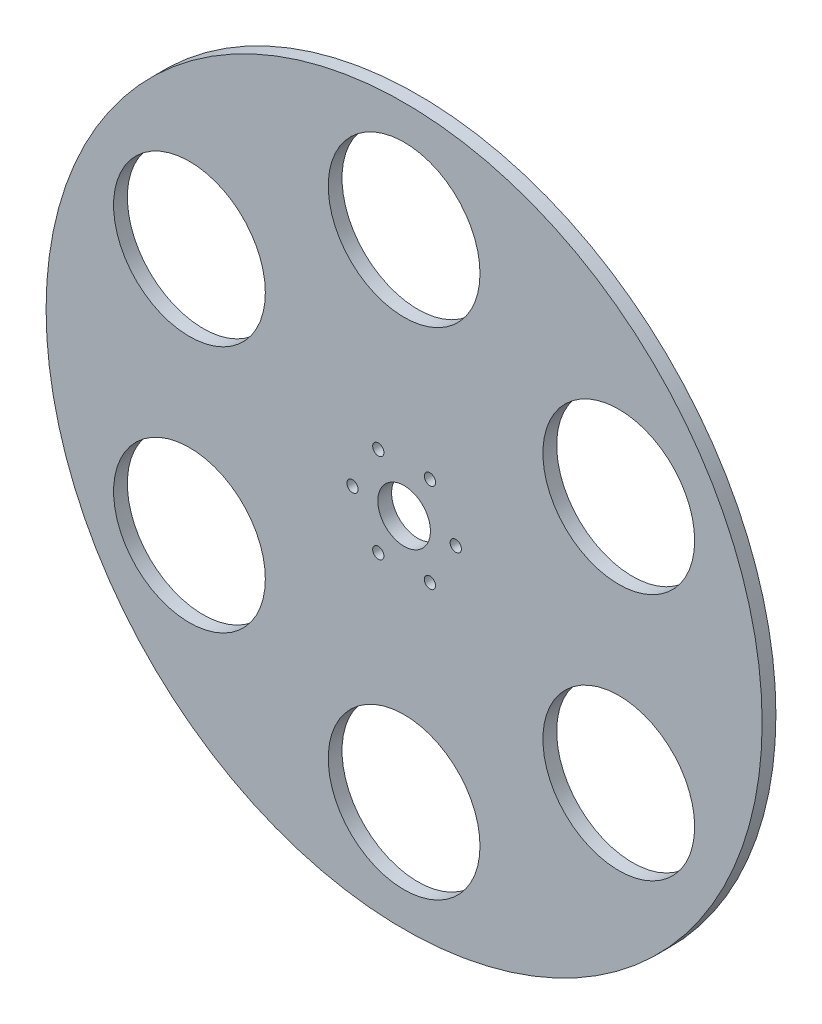
ISO-10303-21;
HEADER;
FILE_DESCRIPTION(('STEP AP214'),'2;1');
FILE_NAME('part.step','',(''),(''),'','','');
FILE_SCHEMA(('AUTOMOTIVE_DESIGN { 1 0 10303 214 1 1 1 1 }'));
ENDSEC;
DATA;
#1=APPLICATION_CONTEXT('core data for automotive mechanical design processes');
#2=APPLICATION_PROTOCOL_DEFINITION('international standard','automotive_design',2000,#1);
#3=PRODUCT_CONTEXT('',#1,'mechanical');
#4=PRODUCT('Part','Part','',(#3));
#5=PRODUCT_RELATED_PRODUCT_CATEGORY('part','',(#4));
#6=PRODUCT_DEFINITION_FORMATION('','',#4);
#7=PRODUCT_DEFINITION_CONTEXT('part definition',#1,'design');
#8=PRODUCT_DEFINITION('design','',#6,#7);
#9=PRODUCT_DEFINITION_SHAPE('','',#8);
#10=(LENGTH_UNIT() NAMED_UNIT(*) SI_UNIT(.MILLI.,.METRE.));
#11=(NAMED_UNIT(*) PLANE_ANGLE_UNIT() SI_UNIT($,.RADIAN.));
#12=(NAMED_UNIT(*) SI_UNIT($,.STERADIAN.) SOLID_ANGLE_UNIT());
#13=UNCERTAINTY_MEASURE_WITH_UNIT(LENGTH_MEASURE(1.E-05),#10,'distance_accuracy_value','');
#14=(GEOMETRIC_REPRESENTATION_CONTEXT(3) GLOBAL_UNCERTAINTY_ASSIGNED_CONTEXT((#13)) GLOBAL_UNIT_ASSIGNED_CONTEXT((#10,
#11,#12)) REPRESENTATION_CONTEXT('',''));
#15=CARTESIAN_POINT('',(0.,0.,0.));
#16=DIRECTION('',(0.,0.,1.));
#17=DIRECTION('',(1.,0.,0.));
#18=AXIS2_PLACEMENT_3D('',#15,#16,#17);
#19=CARTESIAN_POINT('',(0.,0.,3.175));
#20=DIRECTION('',(0.,0.,1.));
#21=DIRECTION('',(1.,0.,0.));
#22=AXIS2_PLACEMENT_3D('',#19,#20,#21);
#23=PLANE('',#22);
#24=CARTESIAN_POINT('',(11.9062500000002,-20.6222299276171,3.175));
#25=DIRECTION('',(0.,0.,1.));
#26=DIRECTION('',(1.,0.,0.));
#27=AXIS2_PLACEMENT_3D('',#24,#25,#26);
#28=CIRCLE('',#27,2.5908);
#29=CARTESIAN_POINT('',(14.4970500000002,-20.6222299276171,3.175));
#30=VERTEX_POINT('',#29);
#31=EDGE_CURVE('E130',#30,#30,#28,.F.);
#32=ORIENTED_EDGE('',*,*,#31,.T.);
#33=EDGE_LOOP('',(#32));
#34=FACE_BOUND('',#33,.T.);
#35=CARTESIAN_POINT('',(-11.9062499999998,-20.6222299276174,3.175));
#36=DIRECTION('',(0.,0.,1.));
#37=DIRECTION('',(1.,0.,0.));
#38=AXIS2_PLACEMENT_3D('',#35,#36,#37);
#39=CIRCLE('',#38,2.5908);
#40=CARTESIAN_POINT('',(-9.31544999999975,-20.6222299276174,3.175));
#41=VERTEX_POINT('',#40);
#42=EDGE_CURVE('E134',#41,#41,#39,.F.);
#43=ORIENTED_EDGE('',*,*,#42,.T.);
#44=EDGE_LOOP('',(#43));
#45=FACE_BOUND('',#44,.T.);
#46=CARTESIAN_POINT('',(-23.8125,-5.93829665384531E-13,3.175));
#47=DIRECTION('',(0.,0.,1.));
#48=DIRECTION('',(1.,0.,0.));
#49=AXIS2_PLACEMENT_3D('',#46,#47,#48);
#50=CIRCLE('',#49,2.59080000000001);
#51=CARTESIAN_POINT('',(-21.2217,-5.93829665384531E-13,3.175));
#52=VERTEX_POINT('',#51);
#53=EDGE_CURVE('E138',#52,#52,#50,.F.);
#54=ORIENTED_EDGE('',*,*,#53,.T.);
#55=EDGE_LOOP('',(#54));
#56=FACE_BOUND('',#55,.T.);
#57=CARTESIAN_POINT('',(-11.9062500000003,20.6222299276165,3.175));
#58=DIRECTION('',(0.,0.,1.));
#59=DIRECTION('',(1.,0.,0.));
#60=AXIS2_PLACEMENT_3D('',#57,#58,#59);
#61=CIRCLE('',#60,2.5908);
#62=CARTESIAN_POINT('',(-9.31545000000025,20.6222299276165,3.175));
#63=VERTEX_POINT('',#62);
#64=EDGE_CURVE('E142',#63,#63,#61,.F.);
#65=ORIENTED_EDGE('',*,*,#64,.T.);
#66=EDGE_LOOP('',(#65));
#67=FACE_BOUND('',#66,.T.);
#68=CARTESIAN_POINT('',(11.9062499999997,20.6222299276168,3.175));
#69=DIRECTION('',(0.,0.,1.));
#70=DIRECTION('',(1.,0.,0.));
#71=AXIS2_PLACEMENT_3D('',#68,#69,#70);
#72=CIRCLE('',#71,2.5908);
#73=CARTESIAN_POINT('',(14.4970499999998,20.6222299276168,3.175));
#74=VERTEX_POINT('',#73);
#75=EDGE_CURVE('E146',#74,#74,#72,.F.);
#76=ORIENTED_EDGE('',*,*,#75,.T.);
#77=EDGE_LOOP('',(#76));
#78=FACE_BOUND('',#77,.T.);
#79=CARTESIAN_POINT('',(23.8125,0.,3.175));
#80=DIRECTION('',(0.,0.,1.));
#81=DIRECTION('',(1.,0.,0.));
#82=AXIS2_PLACEMENT_3D('',#79,#80,#81);
#83=CIRCLE('',#82,2.5908);
#84=CARTESIAN_POINT('',(26.4033,0.,3.175));
#85=VERTEX_POINT('',#84);
#86=EDGE_CURVE('E67',#85,#85,#83,.F.);
#87=ORIENTED_EDGE('',*,*,#86,.T.);
#88=EDGE_LOOP('',(#87));
#89=FACE_BOUND('',#88,.T.);
#90=CARTESIAN_POINT('',(-98.9867036525522,-57.1500000000053,3.175));
#91=DIRECTION('',(0.,0.,1.));
#92=DIRECTION('',(1.,0.,0.));
#93=AXIS2_PLACEMENT_3D('',#90,#91,#92);
#94=CIRCLE('',#93,34.9885);
#95=CARTESIAN_POINT('',(-63.9982036525522,-57.1500000000053,3.175));
#96=VERTEX_POINT('',#95);
#97=EDGE_CURVE('E69',#96,#96,#94,.T.);
#98=ORIENTED_EDGE('',*,*,#97,.F.);
#99=EDGE_LOOP('',(#98));
#100=FACE_BOUND('',#99,.T.);
#101=CARTESIAN_POINT('',(98.9867036525704,-57.1499999999947,3.175));
#102=DIRECTION('',(0.,0.,1.));
#103=DIRECTION('',(1.,0.,0.));
#104=AXIS2_PLACEMENT_3D('',#101,#102,#103);
#105=CIRCLE('',#104,34.9885);
#106=CARTESIAN_POINT('',(133.97520365257,-57.1499999999947,3.175));
#107=VERTEX_POINT('',#106);
#108=EDGE_CURVE('E83',#107,#107,#105,.T.);
#109=ORIENTED_EDGE('',*,*,#108,.F.);
#110=EDGE_LOOP('',(#109));
#111=FACE_BOUND('',#110,.T.);
#112=CARTESIAN_POINT('',(0.,0.,3.175));
#113=DIRECTION('',(0.,0.,1.));
#114=DIRECTION('',(1.,0.,0.));
#115=AXIS2_PLACEMENT_3D('',#112,#113,#114);
#116=CIRCLE('',#115,12.1285);
#117=CARTESIAN_POINT('',(12.1285,0.,3.175));
#118=VERTEX_POINT('',#117);
#119=EDGE_CURVE('E52',#118,#118,#116,.T.);
#120=ORIENTED_EDGE('',*,*,#119,.F.);
#121=EDGE_LOOP('',(#120));
#122=FACE_BOUND('',#121,.T.);
#123=CARTESIAN_POINT('',(0.,0.,3.175));
#124=DIRECTION('',(0.,0.,1.));
#125=DIRECTION('',(1.,0.,0.));
#126=AXIS2_PLACEMENT_3D('',#123,#124,#125);
#127=CIRCLE('',#126,165.1);
#128=CARTESIAN_POINT('',(165.1,0.,3.175));
#129=VERTEX_POINT('',#128);
#130=EDGE_CURVE('E11',#129,#129,#127,.T.);
#131=ORIENTED_EDGE('',*,*,#130,.T.);
#132=EDGE_LOOP('',(#131));
#133=FACE_BOUND('',#132,.T.);
#134=CARTESIAN_POINT('',(0.,114.3,3.175));
#135=DIRECTION('',(0.,0.,1.));
#136=DIRECTION('',(1.,0.,0.));
#137=AXIS2_PLACEMENT_3D('',#134,#135,#136);
#138=CIRCLE('',#137,34.9885);
#139=CARTESIAN_POINT('',(34.9885,114.3,3.175));
#140=VERTEX_POINT('',#139);
#141=EDGE_CURVE('E46',#140,#140,#138,.T.);
#142=ORIENTED_EDGE('',*,*,#141,.F.);
#143=EDGE_LOOP('',(#142));
#144=FACE_BOUND('',#143,.T.);
#145=CARTESIAN_POINT('',(98.9867036525643,57.1500000000053,3.175));
#146=DIRECTION('',(0.,0.,1.));
#147=DIRECTION('',(1.,0.,0.));
#148=AXIS2_PLACEMENT_3D('',#145,#146,#147);
#149=CIRCLE('',#148,34.9885);
#150=CARTESIAN_POINT('',(133.975203652564,57.1500000000053,3.175));
#151=VERTEX_POINT('',#150);
#152=EDGE_CURVE('E90',#151,#151,#149,.T.);
#153=ORIENTED_EDGE('',*,*,#152,.F.);
#154=EDGE_LOOP('',(#153));
#155=FACE_BOUND('',#154,.T.);
#156=CARTESIAN_POINT('',(1.21510900920431E-11,-114.3,3.175));
#157=DIRECTION('',(0.,0.,1.));
#158=DIRECTION('',(1.,0.,0.));
#159=AXIS2_PLACEMENT_3D('',#156,#157,#158);
#160=CIRCLE('',#159,34.9885);
#161=CARTESIAN_POINT('',(34.9885000000122,-114.3,3.175));
#162=VERTEX_POINT('',#161);
#163=EDGE_CURVE('E76',#162,#162,#160,.T.);
#164=ORIENTED_EDGE('',*,*,#163,.F.);
#165=EDGE_LOOP('',(#164));
#166=FACE_BOUND('',#165,.T.);
#167=CARTESIAN_POINT('',(-98.9867036525583,57.1499999999947,3.175));
#168=DIRECTION('',(0.,0.,1.));
#169=DIRECTION('',(1.,0.,0.));
#170=AXIS2_PLACEMENT_3D('',#167,#168,#169);
#171=CIRCLE('',#170,34.9885);
#172=CARTESIAN_POINT('',(-63.9982036525583,57.1499999999947,3.175));
#173=VERTEX_POINT('',#172);
#174=EDGE_CURVE('E66',#173,#173,#171,.T.);
#175=ORIENTED_EDGE('',*,*,#174,.F.);
#176=EDGE_LOOP('',(#175));
#177=FACE_BOUND('',#176,.T.);
#178=ADVANCED_FACE('F34',(#34,#45,#56,#67,#78,#89,#100,#111,#122,#133,#144,#155,#166,#177),#23,.T.);
#179=CARTESIAN_POINT('',(0.,0.,-3.175));
#180=DIRECTION('',(0.,0.,1.));
#181=DIRECTION('',(1.,0.,0.));
#182=AXIS2_PLACEMENT_3D('',#179,#180,#181);
#183=PLANE('',#182);
#184=CARTESIAN_POINT('',(11.9062500000002,-20.6222299276171,-3.175));
#185=DIRECTION('',(0.,0.,-1.));
#186=DIRECTION('',(-1.,0.,0.));
#187=AXIS2_PLACEMENT_3D('',#184,#185,#186);
#188=CIRCLE('',#187,2.5908);
#189=CARTESIAN_POINT('',(9.31545000000024,-20.6222299276171,-3.175));
#190=VERTEX_POINT('',#189);
#191=EDGE_CURVE('E290',#190,#190,#188,.T.);
#192=ORIENTED_EDGE('',*,*,#191,.F.);
#193=EDGE_LOOP('',(#192));
#194=FACE_BOUND('',#193,.T.);
#195=CARTESIAN_POINT('',(-11.9062499999998,-20.6222299276174,-3.175));
#196=DIRECTION('',(0.,0.,-1.));
#197=DIRECTION('',(-1.,0.,0.));
#198=AXIS2_PLACEMENT_3D('',#195,#196,#197);
#199=CIRCLE('',#198,2.5908);
#200=CARTESIAN_POINT('',(-14.4970499999998,-20.6222299276174,-3.175));
#201=VERTEX_POINT('',#200);
#202=EDGE_CURVE('E291',#201,#201,#199,.T.);
#203=ORIENTED_EDGE('',*,*,#202,.F.);
#204=EDGE_LOOP('',(#203));
#205=FACE_BOUND('',#204,.T.);
#206=CARTESIAN_POINT('',(-23.8125,-5.93829665384531E-13,-3.175));
#207=DIRECTION('',(0.,0.,-1.));
#208=DIRECTION('',(-1.,0.,0.));
#209=AXIS2_PLACEMENT_3D('',#206,#207,#208);
#210=CIRCLE('',#209,2.59080000000001);
#211=CARTESIAN_POINT('',(-26.4033,-5.93829665384531E-13,-3.175));
#212=VERTEX_POINT('',#211);
#213=EDGE_CURVE('E298',#212,#212,#210,.T.);
#214=ORIENTED_EDGE('',*,*,#213,.F.);
#215=EDGE_LOOP('',(#214));
#216=FACE_BOUND('',#215,.T.);
#217=CARTESIAN_POINT('',(-11.9062500000003,20.6222299276165,-3.175));
#218=DIRECTION('',(0.,0.,-1.));
#219=DIRECTION('',(-1.,0.,0.));
#220=AXIS2_PLACEMENT_3D('',#217,#218,#219);
#221=CIRCLE('',#220,2.5908);
#222=CARTESIAN_POINT('',(-14.4970500000003,20.6222299276165,-3.175));
#223=VERTEX_POINT('',#222);
#224=EDGE_CURVE('E302',#223,#223,#221,.T.);
#225=ORIENTED_EDGE('',*,*,#224,.F.);
#226=EDGE_LOOP('',(#225));
#227=FACE_BOUND('',#226,.T.);
#228=CARTESIAN_POINT('',(11.9062499999997,20.6222299276168,-3.175));
#229=DIRECTION('',(0.,0.,-1.));
#230=DIRECTION('',(-1.,0.,0.));
#231=AXIS2_PLACEMENT_3D('',#228,#229,#230);
#232=CIRCLE('',#231,2.5908);
#233=CARTESIAN_POINT('',(9.31544999999975,20.6222299276168,-3.175));
#234=VERTEX_POINT('',#233);
#235=EDGE_CURVE('E306',#234,#234,#232,.T.);
#236=ORIENTED_EDGE('',*,*,#235,.F.);
#237=EDGE_LOOP('',(#236));
#238=FACE_BOUND('',#237,.T.);
#239=CARTESIAN_POINT('',(23.8125,0.,-3.175));
#240=DIRECTION('',(0.,0.,-1.));
#241=DIRECTION('',(-1.,0.,0.));
#242=AXIS2_PLACEMENT_3D('',#239,#240,#241);
#243=CIRCLE('',#242,2.5908);
#244=CARTESIAN_POINT('',(21.2217,0.,-3.175));
#245=VERTEX_POINT('',#244);
#246=EDGE_CURVE('E310',#245,#245,#243,.T.);
#247=ORIENTED_EDGE('',*,*,#246,.F.);
#248=EDGE_LOOP('',(#247));
#249=FACE_BOUND('',#248,.T.);
#250=CARTESIAN_POINT('',(0.,0.,-3.175));
#251=DIRECTION('',(0.,0.,1.));
#252=DIRECTION('',(1.,0.,0.));
#253=AXIS2_PLACEMENT_3D('',#250,#251,#252);
#254=CIRCLE('',#253,165.1);
#255=CARTESIAN_POINT('',(165.1,0.,-3.175));
#256=VERTEX_POINT('',#255);
#257=EDGE_CURVE('E38',#256,#256,#254,.T.);
#258=ORIENTED_EDGE('',*,*,#257,.F.);
#259=EDGE_LOOP('',(#258));
#260=FACE_BOUND('',#259,.T.);
#261=CARTESIAN_POINT('',(0.,114.3,-3.175));
#262=DIRECTION('',(0.,0.,1.));
#263=DIRECTION('',(1.,0.,0.));
#264=AXIS2_PLACEMENT_3D('',#261,#262,#263);
#265=CIRCLE('',#264,34.9885);
#266=CARTESIAN_POINT('',(34.9885,114.3,-3.175));
#267=VERTEX_POINT('',#266);
#268=EDGE_CURVE('E48',#267,#267,#265,.T.);
#269=ORIENTED_EDGE('',*,*,#268,.T.);
#270=EDGE_LOOP('',(#269));
#271=FACE_BOUND('',#270,.T.);
#272=CARTESIAN_POINT('',(0.,0.,-3.175));
#273=DIRECTION('',(0.,0.,1.));
#274=DIRECTION('',(1.,0.,0.));
#275=AXIS2_PLACEMENT_3D('',#272,#273,#274);
#276=CIRCLE('',#275,12.1285);
#277=CARTESIAN_POINT('',(12.1285,0.,-3.175));
#278=VERTEX_POINT('',#277);
#279=EDGE_CURVE('E92',#278,#278,#276,.T.);
#280=ORIENTED_EDGE('',*,*,#279,.T.);
#281=EDGE_LOOP('',(#280));
#282=FACE_BOUND('',#281,.T.);
#283=CARTESIAN_POINT('',(98.9867036525643,57.1500000000053,-3.175));
#284=DIRECTION('',(0.,0.,1.));
#285=DIRECTION('',(1.,0.,0.));
#286=AXIS2_PLACEMENT_3D('',#283,#284,#285);
#287=CIRCLE('',#286,34.9885);
#288=CARTESIAN_POINT('',(133.975203652564,57.1500000000053,-3.175));
#289=VERTEX_POINT('',#288);
#290=EDGE_CURVE('E93',#289,#289,#287,.T.);
#291=ORIENTED_EDGE('',*,*,#290,.T.);
#292=EDGE_LOOP('',(#291));
#293=FACE_BOUND('',#292,.T.);
#294=CARTESIAN_POINT('',(98.9867036525704,-57.1499999999947,-3.175));
#295=DIRECTION('',(0.,0.,1.));
#296=DIRECTION('',(1.,0.,0.));
#297=AXIS2_PLACEMENT_3D('',#294,#295,#296);
#298=CIRCLE('',#297,34.9885);
#299=CARTESIAN_POINT('',(133.97520365257,-57.1499999999947,-3.175));
#300=VERTEX_POINT('',#299);
#301=EDGE_CURVE('E79',#300,#300,#298,.T.);
#302=ORIENTED_EDGE('',*,*,#301,.T.);
#303=EDGE_LOOP('',(#302));
#304=FACE_BOUND('',#303,.T.);
#305=CARTESIAN_POINT('',(1.21510900920431E-11,-114.3,-3.175));
#306=DIRECTION('',(0.,0.,1.));
#307=DIRECTION('',(1.,0.,0.));
#308=AXIS2_PLACEMENT_3D('',#305,#306,#307);
#309=CIRCLE('',#308,34.9885);
#310=CARTESIAN_POINT('',(34.9885000000122,-114.3,-3.175));
#311=VERTEX_POINT('',#310);
#312=EDGE_CURVE('E71',#311,#311,#309,.T.);
#313=ORIENTED_EDGE('',*,*,#312,.T.);
#314=EDGE_LOOP('',(#313));
#315=FACE_BOUND('',#314,.T.);
#316=CARTESIAN_POINT('',(-98.9867036525522,-57.1500000000053,-3.175));
#317=DIRECTION('',(0.,0.,1.));
#318=DIRECTION('',(1.,0.,0.));
#319=AXIS2_PLACEMENT_3D('',#316,#317,#318);
#320=CIRCLE('',#319,34.9885);
#321=CARTESIAN_POINT('',(-63.9982036525522,-57.1500000000053,-3.175));
#322=VERTEX_POINT('',#321);
#323=EDGE_CURVE('E72',#322,#322,#320,.T.);
#324=ORIENTED_EDGE('',*,*,#323,.T.);
#325=EDGE_LOOP('',(#324));
#326=FACE_BOUND('',#325,.T.);
#327=CARTESIAN_POINT('',(-98.9867036525583,57.1499999999947,-3.175));
#328=DIRECTION('',(0.,0.,1.));
#329=DIRECTION('',(1.,0.,0.));
#330=AXIS2_PLACEMENT_3D('',#327,#328,#329);
#331=CIRCLE('',#330,34.9885);
#332=CARTESIAN_POINT('',(-63.9982036525583,57.1499999999947,-3.175));
#333=VERTEX_POINT('',#332);
#334=EDGE_CURVE('E61',#333,#333,#331,.T.);
#335=ORIENTED_EDGE('',*,*,#334,.T.);
#336=EDGE_LOOP('',(#335));
#337=FACE_BOUND('',#336,.T.);
#338=ADVANCED_FACE('F102',(#194,#205,#216,#227,#238,#249,#260,#271,#282,#293,#304,#315,#326,
#337),#183,.F.);
#339=CARTESIAN_POINT('',(0.,0.,3.175));
#340=DIRECTION('',(0.,0.,-1.));
#341=DIRECTION('',(-1.,0.,0.));
#342=AXIS2_PLACEMENT_3D('',#339,#340,#341);
#343=CYLINDRICAL_SURFACE('',#342,165.1);
#344=ORIENTED_EDGE('',*,*,#130,.F.);
#345=EDGE_LOOP('',(#344));
#346=FACE_BOUND('',#345,.T.);
#347=ORIENTED_EDGE('',*,*,#257,.T.);
#348=EDGE_LOOP('',(#347));
#349=FACE_BOUND('',#348,.T.);
#350=ADVANCED_FACE('F36',(#346,#349),#343,.T.);
#351=CARTESIAN_POINT('',(0.,114.3,3.175));
#352=DIRECTION('',(0.,0.,-1.));
#353=DIRECTION('',(-1.,0.,0.));
#354=AXIS2_PLACEMENT_3D('',#351,#352,#353);
#355=CYLINDRICAL_SURFACE('',#354,34.9885);
#356=ORIENTED_EDGE('',*,*,#141,.T.);
#357=EDGE_LOOP('',(#356));
#358=FACE_BOUND('',#357,.T.);
#359=ORIENTED_EDGE('',*,*,#268,.F.);
#360=EDGE_LOOP('',(#359));
#361=FACE_BOUND('',#360,.T.);
#362=ADVANCED_FACE('F108',(#358,#361),#355,.F.);
#363=CARTESIAN_POINT('',(0.,0.,3.175));
#364=DIRECTION('',(0.,0.,-1.));
#365=DIRECTION('',(-1.,0.,0.));
#366=AXIS2_PLACEMENT_3D('',#363,#364,#365);
#367=CYLINDRICAL_SURFACE('',#366,12.1285);
#368=ORIENTED_EDGE('',*,*,#119,.T.);
#369=EDGE_LOOP('',(#368));
#370=FACE_BOUND('',#369,.T.);
#371=ORIENTED_EDGE('',*,*,#279,.F.);
#372=EDGE_LOOP('',(#371));
#373=FACE_BOUND('',#372,.T.);
#374=ADVANCED_FACE('F105',(#370,#373),#367,.F.);
#375=CARTESIAN_POINT('',(98.9867036525643,57.1500000000053,3.175));
#376=DIRECTION('',(0.,0.,-1.));
#377=DIRECTION('',(-1.,0.,0.));
#378=AXIS2_PLACEMENT_3D('',#375,#376,#377);
#379=CYLINDRICAL_SURFACE('',#378,34.9885);
#380=ORIENTED_EDGE('',*,*,#152,.T.);
#381=EDGE_LOOP('',(#380));
#382=FACE_BOUND('',#381,.T.);
#383=ORIENTED_EDGE('',*,*,#290,.F.);
#384=EDGE_LOOP('',(#383));
#385=FACE_BOUND('',#384,.T.);
#386=ADVANCED_FACE('F107',(#382,#385),#379,.F.);
#387=CARTESIAN_POINT('',(98.9867036525704,-57.1499999999947,3.175));
#388=DIRECTION('',(0.,0.,-1.));
#389=DIRECTION('',(-1.,0.,0.));
#390=AXIS2_PLACEMENT_3D('',#387,#388,#389);
#391=CYLINDRICAL_SURFACE('',#390,34.9885);
#392=ORIENTED_EDGE('',*,*,#108,.T.);
#393=EDGE_LOOP('',(#392));
#394=FACE_BOUND('',#393,.T.);
#395=ORIENTED_EDGE('',*,*,#301,.F.);
#396=EDGE_LOOP('',(#395));
#397=FACE_BOUND('',#396,.T.);
#398=ADVANCED_FACE('F115',(#394,#397),#391,.F.);
#399=CARTESIAN_POINT('',(1.21510900920431E-11,-114.3,3.175));
#400=DIRECTION('',(0.,0.,-1.));
#401=DIRECTION('',(-1.,0.,0.));
#402=AXIS2_PLACEMENT_3D('',#399,#400,#401);
#403=CYLINDRICAL_SURFACE('',#402,34.9885);
#404=ORIENTED_EDGE('',*,*,#163,.T.);
#405=EDGE_LOOP('',(#404));
#406=FACE_BOUND('',#405,.T.);
#407=ORIENTED_EDGE('',*,*,#312,.F.);
#408=EDGE_LOOP('',(#407));
#409=FACE_BOUND('',#408,.T.);
#410=ADVANCED_FACE('F182',(#406,#409),#403,.F.);
#411=CARTESIAN_POINT('',(-98.9867036525522,-57.1500000000053,3.175));
#412=DIRECTION('',(0.,0.,-1.));
#413=DIRECTION('',(-1.,0.,0.));
#414=AXIS2_PLACEMENT_3D('',#411,#412,#413);
#415=CYLINDRICAL_SURFACE('',#414,34.9885);
#416=ORIENTED_EDGE('',*,*,#97,.T.);
#417=EDGE_LOOP('',(#416));
#418=FACE_BOUND('',#417,.T.);
#419=ORIENTED_EDGE('',*,*,#323,.F.);
#420=EDGE_LOOP('',(#419));
#421=FACE_BOUND('',#420,.T.);
#422=ADVANCED_FACE('F171',(#418,#421),#415,.F.);
#423=CARTESIAN_POINT('',(-98.9867036525583,57.1499999999947,3.175));
#424=DIRECTION('',(0.,0.,-1.));
#425=DIRECTION('',(-1.,0.,0.));
#426=AXIS2_PLACEMENT_3D('',#423,#424,#425);
#427=CYLINDRICAL_SURFACE('',#426,34.9885);
#428=ORIENTED_EDGE('',*,*,#174,.T.);
#429=EDGE_LOOP('',(#428));
#430=FACE_BOUND('',#429,.T.);
#431=ORIENTED_EDGE('',*,*,#334,.F.);
#432=EDGE_LOOP('',(#431));
#433=FACE_BOUND('',#432,.T.);
#434=ADVANCED_FACE('F167',(#430,#433),#427,.F.);
#435=CARTESIAN_POINT('',(23.8125,0.,10.5028889947924));
#436=DIRECTION('',(0.,0.,-1.));
#437=DIRECTION('',(-1.,0.,0.));
#438=AXIS2_PLACEMENT_3D('',#435,#436,#437);
#439=CYLINDRICAL_SURFACE('',#438,2.5908);
#440=ORIENTED_EDGE('',*,*,#246,.T.);
#441=EDGE_LOOP('',(#440));
#442=FACE_BOUND('',#441,.T.);
#443=ORIENTED_EDGE('',*,*,#86,.F.);
#444=EDGE_LOOP('',(#443));
#445=FACE_BOUND('',#444,.T.);
#446=ADVANCED_FACE('F170',(#442,#445),#439,.F.);
#447=CARTESIAN_POINT('',(11.9062499999997,20.6222299276168,10.5028889947924));
#448=DIRECTION('',(0.,0.,-1.));
#449=DIRECTION('',(-1.,0.,0.));
#450=AXIS2_PLACEMENT_3D('',#447,#448,#449);
#451=CYLINDRICAL_SURFACE('',#450,2.5908);
#452=ORIENTED_EDGE('',*,*,#235,.T.);
#453=EDGE_LOOP('',(#452));
#454=FACE_BOUND('',#453,.T.);
#455=ORIENTED_EDGE('',*,*,#75,.F.);
#456=EDGE_LOOP('',(#455));
#457=FACE_BOUND('',#456,.T.);
#458=ADVANCED_FACE('F179',(#454,#457),#451,.F.);
#459=CARTESIAN_POINT('',(-11.9062500000003,20.6222299276165,10.5028889947924));
#460=DIRECTION('',(0.,0.,-1.));
#461=DIRECTION('',(-1.,0.,0.));
#462=AXIS2_PLACEMENT_3D('',#459,#460,#461);
#463=CYLINDRICAL_SURFACE('',#462,2.5908);
#464=ORIENTED_EDGE('',*,*,#224,.T.);
#465=EDGE_LOOP('',(#464));
#466=FACE_BOUND('',#465,.T.);
#467=ORIENTED_EDGE('',*,*,#64,.F.);
#468=EDGE_LOOP('',(#467));
#469=FACE_BOUND('',#468,.T.);
#470=ADVANCED_FACE('F244',(#466,#469),#463,.F.);
#471=CARTESIAN_POINT('',(-23.8125,-5.93829665384531E-13,10.5028889947924));
#472=DIRECTION('',(0.,0.,-1.));
#473=DIRECTION('',(-1.,0.,0.));
#474=AXIS2_PLACEMENT_3D('',#471,#472,#473);
#475=CYLINDRICAL_SURFACE('',#474,2.59080000000001);
#476=ORIENTED_EDGE('',*,*,#213,.T.);
#477=EDGE_LOOP('',(#476));
#478=FACE_BOUND('',#477,.T.);
#479=ORIENTED_EDGE('',*,*,#53,.F.);
#480=EDGE_LOOP('',(#479));
#481=FACE_BOUND('',#480,.T.);
#482=ADVANCED_FACE('F253',(#478,#481),#475,.F.);
#483=CARTESIAN_POINT('',(-11.9062499999998,-20.6222299276174,10.5028889947924));
#484=DIRECTION('',(0.,0.,-1.));
#485=DIRECTION('',(-1.,0.,0.));
#486=AXIS2_PLACEMENT_3D('',#483,#484,#485);
#487=CYLINDRICAL_SURFACE('',#486,2.5908);
#488=ORIENTED_EDGE('',*,*,#202,.T.);
#489=EDGE_LOOP('',(#488));
#490=FACE_BOUND('',#489,.T.);
#491=ORIENTED_EDGE('',*,*,#42,.F.);
#492=EDGE_LOOP('',(#491));
#493=FACE_BOUND('',#492,.T.);
#494=ADVANCED_FACE('F263',(#490,#493),#487,.F.);
#495=CARTESIAN_POINT('',(11.9062500000002,-20.6222299276171,10.5028889947924));
#496=DIRECTION('',(0.,0.,-1.));
#497=DIRECTION('',(-1.,0.,0.));
#498=AXIS2_PLACEMENT_3D('',#495,#496,#497);
#499=CYLINDRICAL_SURFACE('',#498,2.5908);
#500=ORIENTED_EDGE('',*,*,#191,.T.);
#501=EDGE_LOOP('',(#500));
#502=FACE_BOUND('',#501,.T.);
#503=ORIENTED_EDGE('',*,*,#31,.F.);
#504=EDGE_LOOP('',(#503));
#505=FACE_BOUND('',#504,.T.);
#506=ADVANCED_FACE('F273',(#502,#505),#499,.F.);
#507=CLOSED_SHELL('',(#178,#338,#350,#362,#374,#386,#398,#410,#422,#434,#446,#458,#470,#482,
#494,#506));
#508=MANIFOLD_SOLID_BREP('B2',#507);
#509=ADVANCED_BREP_SHAPE_REPRESENTATION('',(#18,#508),#14);
#510=SHAPE_DEFINITION_REPRESENTATION(#9,#509);
ENDSEC;
END-ISO-10303-21;
